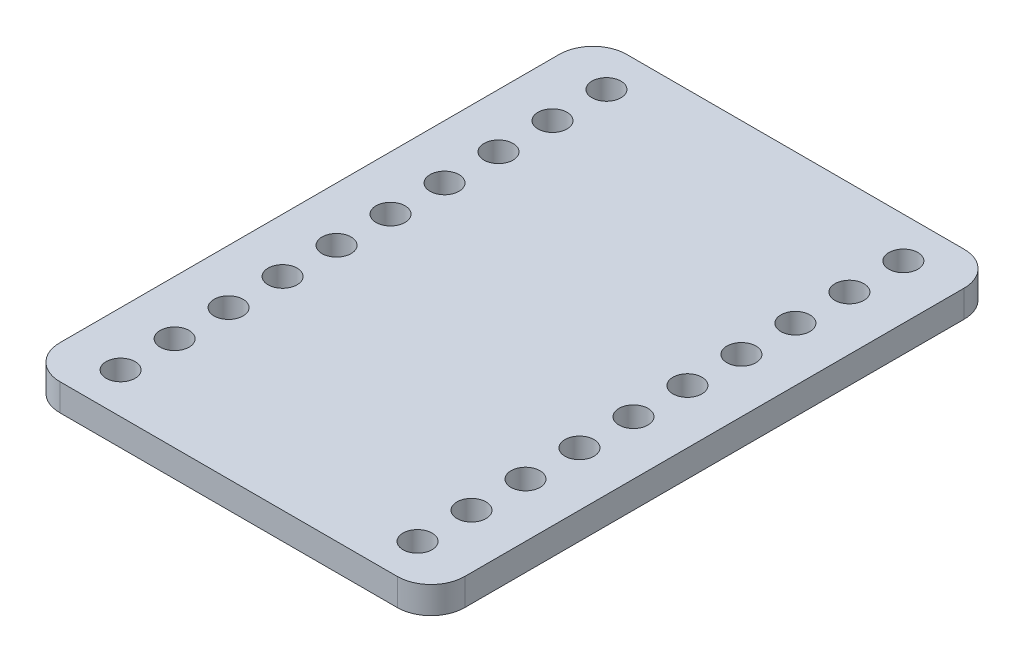
ISO-10303-21;
HEADER;
FILE_DESCRIPTION(('STEP AP214'),'2;1');
FILE_NAME('part.step','',(''),(''),'','','');
FILE_SCHEMA(('AUTOMOTIVE_DESIGN { 1 0 10303 214 1 1 1 1 }'));
ENDSEC;
DATA;
#1=APPLICATION_CONTEXT('core data for automotive mechanical design processes');
#2=APPLICATION_PROTOCOL_DEFINITION('international standard','automotive_design',2000,#1);
#3=PRODUCT_CONTEXT('',#1,'mechanical');
#4=PRODUCT('Part','Part','',(#3));
#5=PRODUCT_RELATED_PRODUCT_CATEGORY('part','',(#4));
#6=PRODUCT_DEFINITION_FORMATION('','',#4);
#7=PRODUCT_DEFINITION_CONTEXT('part definition',#1,'design');
#8=PRODUCT_DEFINITION('design','',#6,#7);
#9=PRODUCT_DEFINITION_SHAPE('','',#8);
#10=(LENGTH_UNIT() NAMED_UNIT(*) SI_UNIT(.MILLI.,.METRE.));
#11=(NAMED_UNIT(*) PLANE_ANGLE_UNIT() SI_UNIT($,.RADIAN.));
#12=(NAMED_UNIT(*) SI_UNIT($,.STERADIAN.) SOLID_ANGLE_UNIT());
#13=UNCERTAINTY_MEASURE_WITH_UNIT(LENGTH_MEASURE(1.E-05),#10,'distance_accuracy_value','');
#14=(GEOMETRIC_REPRESENTATION_CONTEXT(3) GLOBAL_UNCERTAINTY_ASSIGNED_CONTEXT((#13)) GLOBAL_UNIT_ASSIGNED_CONTEXT((#10,
#11,#12)) REPRESENTATION_CONTEXT('',''));
#15=CARTESIAN_POINT('',(0.,0.,0.));
#16=DIRECTION('',(0.,0.,1.));
#17=DIRECTION('',(1.,0.,0.));
#18=AXIS2_PLACEMENT_3D('',#15,#16,#17);
#19=CARTESIAN_POINT('',(0.,4.,0.));
#20=DIRECTION('',(0.,1.,0.));
#21=DIRECTION('',(0.,0.,1.));
#22=AXIS2_PLACEMENT_3D('',#19,#20,#21);
#23=PLANE('',#22);
#24=CARTESIAN_POINT('',(-21.9999999999993,4.,28.));
#25=DIRECTION('',(0.,1.,0.));
#26=DIRECTION('',(0.,0.,1.));
#27=AXIS2_PLACEMENT_3D('',#24,#25,#26);
#28=CIRCLE('',#27,2.15);
#29=CARTESIAN_POINT('',(-21.9999999999993,4.,30.15));
#30=VERTEX_POINT('',#29);
#31=EDGE_CURVE('E347',#30,#30,#28,.T.);
#32=ORIENTED_EDGE('',*,*,#31,.F.);
#33=EDGE_LOOP('',(#32));
#34=FACE_BOUND('',#33,.T.);
#35=CARTESIAN_POINT('',(-21.9999999999995,4.,12.));
#36=DIRECTION('',(0.,1.,0.));
#37=DIRECTION('',(0.,0.,1.));
#38=AXIS2_PLACEMENT_3D('',#35,#36,#37);
#39=CIRCLE('',#38,2.15);
#40=CARTESIAN_POINT('',(-21.9999999999995,4.,14.15));
#41=VERTEX_POINT('',#40);
#42=EDGE_CURVE('E331',#41,#41,#39,.T.);
#43=ORIENTED_EDGE('',*,*,#42,.F.);
#44=EDGE_LOOP('',(#43));
#45=FACE_BOUND('',#44,.T.);
#46=CARTESIAN_POINT('',(-21.9999999999997,4.,-3.99999999999998));
#47=DIRECTION('',(0.,1.,0.));
#48=DIRECTION('',(0.,0.,1.));
#49=AXIS2_PLACEMENT_3D('',#46,#47,#48);
#50=CIRCLE('',#49,2.15);
#51=CARTESIAN_POINT('',(-21.9999999999997,4.,-1.84999999999998));
#52=VERTEX_POINT('',#51);
#53=EDGE_CURVE('E315',#52,#52,#50,.T.);
#54=ORIENTED_EDGE('',*,*,#53,.F.);
#55=EDGE_LOOP('',(#54));
#56=FACE_BOUND('',#55,.T.);
#57=CARTESIAN_POINT('',(-21.9999999999998,4.,-20.));
#58=DIRECTION('',(0.,1.,0.));
#59=DIRECTION('',(0.,0.,1.));
#60=AXIS2_PLACEMENT_3D('',#57,#58,#59);
#61=CIRCLE('',#60,2.15);
#62=CARTESIAN_POINT('',(-21.9999999999998,4.,-17.85));
#63=VERTEX_POINT('',#62);
#64=EDGE_CURVE('E299',#63,#63,#61,.T.);
#65=ORIENTED_EDGE('',*,*,#64,.F.);
#66=EDGE_LOOP('',(#65));
#67=FACE_BOUND('',#66,.T.);
#68=CARTESIAN_POINT('',(22.0000000000007,4.,36.));
#69=DIRECTION('',(0.,1.,0.));
#70=DIRECTION('',(0.,0.,1.));
#71=AXIS2_PLACEMENT_3D('',#68,#69,#70);
#72=CIRCLE('',#71,2.15);
#73=CARTESIAN_POINT('',(22.0000000000007,4.,38.15));
#74=VERTEX_POINT('',#73);
#75=EDGE_CURVE('E283',#74,#74,#72,.T.);
#76=ORIENTED_EDGE('',*,*,#75,.F.);
#77=EDGE_LOOP('',(#76));
#78=FACE_BOUND('',#77,.T.);
#79=CARTESIAN_POINT('',(22.0000000000006,4.,20.));
#80=DIRECTION('',(0.,1.,0.));
#81=DIRECTION('',(0.,0.,1.));
#82=AXIS2_PLACEMENT_3D('',#79,#80,#81);
#83=CIRCLE('',#82,2.15);
#84=CARTESIAN_POINT('',(22.0000000000006,4.,22.15));
#85=VERTEX_POINT('',#84);
#86=EDGE_CURVE('E267',#85,#85,#83,.T.);
#87=ORIENTED_EDGE('',*,*,#86,.F.);
#88=EDGE_LOOP('',(#87));
#89=FACE_BOUND('',#88,.T.);
#90=CARTESIAN_POINT('',(22.0000000000004,4.,4.00000000000002));
#91=DIRECTION('',(0.,1.,0.));
#92=DIRECTION('',(0.,0.,1.));
#93=AXIS2_PLACEMENT_3D('',#90,#91,#92);
#94=CIRCLE('',#93,2.15);
#95=CARTESIAN_POINT('',(22.0000000000004,4.,6.15000000000001));
#96=VERTEX_POINT('',#95);
#97=EDGE_CURVE('E251',#96,#96,#94,.T.);
#98=ORIENTED_EDGE('',*,*,#97,.F.);
#99=EDGE_LOOP('',(#98));
#100=FACE_BOUND('',#99,.T.);
#101=CARTESIAN_POINT('',(22.0000000000002,4.,-12.));
#102=DIRECTION('',(0.,1.,0.));
#103=DIRECTION('',(0.,0.,1.));
#104=AXIS2_PLACEMENT_3D('',#101,#102,#103);
#105=CIRCLE('',#104,2.15);
#106=CARTESIAN_POINT('',(22.0000000000002,4.,-9.84999999999999));
#107=VERTEX_POINT('',#106);
#108=EDGE_CURVE('E235',#107,#107,#105,.T.);
#109=ORIENTED_EDGE('',*,*,#108,.F.);
#110=EDGE_LOOP('',(#109));
#111=FACE_BOUND('',#110,.T.);
#112=CARTESIAN_POINT('',(22.0000000000001,4.,-28.));
#113=DIRECTION('',(0.,1.,0.));
#114=DIRECTION('',(0.,0.,1.));
#115=AXIS2_PLACEMENT_3D('',#112,#113,#114);
#116=CIRCLE('',#115,2.15);
#117=CARTESIAN_POINT('',(22.0000000000001,4.,-25.85));
#118=VERTEX_POINT('',#117);
#119=EDGE_CURVE('E219',#118,#118,#116,.T.);
#120=ORIENTED_EDGE('',*,*,#119,.F.);
#121=EDGE_LOOP('',(#120));
#122=FACE_BOUND('',#121,.T.);
#123=CARTESIAN_POINT('',(-22.,4.,-36.));
#124=DIRECTION('',(0.,1.,0.));
#125=DIRECTION('',(0.,0.,1.));
#126=AXIS2_PLACEMENT_3D('',#123,#124,#125);
#127=CIRCLE('',#126,2.15);
#128=CARTESIAN_POINT('',(-22.,4.,-33.85));
#129=VERTEX_POINT('',#128);
#130=EDGE_CURVE('E145',#129,#129,#127,.T.);
#131=ORIENTED_EDGE('',*,*,#130,.F.);
#132=EDGE_LOOP('',(#131));
#133=FACE_BOUND('',#132,.T.);
#134=DIRECTION('',(0.,0.,-1.));
#135=VECTOR('',#134,1.);
#136=CARTESIAN_POINT('',(30.,4.,-42.));
#137=LINE('',#136,#135);
#138=CARTESIAN_POINT('',(30.,4.,37.));
#139=VERTEX_POINT('',#138);
#140=CARTESIAN_POINT('',(30.,4.,-37.));
#141=VERTEX_POINT('',#140);
#142=EDGE_CURVE('E151',#139,#141,#137,.T.);
#143=ORIENTED_EDGE('',*,*,#142,.T.);
#144=CARTESIAN_POINT('',(25.,4.,-37.));
#145=DIRECTION('',(0.,1.,0.));
#146=DIRECTION('',(0.,0.,1.));
#147=AXIS2_PLACEMENT_3D('',#144,#145,#146);
#148=CIRCLE('',#147,5.);
#149=CARTESIAN_POINT('',(25.,4.,-42.));
#150=VERTEX_POINT('',#149);
#151=EDGE_CURVE('E174',#141,#150,#148,.T.);
#152=ORIENTED_EDGE('',*,*,#151,.T.);
#153=DIRECTION('',(-1.,0.,0.));
#154=VECTOR('',#153,1.);
#155=CARTESIAN_POINT('',(-30.,4.,-42.));
#156=LINE('',#155,#154);
#157=CARTESIAN_POINT('',(-25.,4.,-42.));
#158=VERTEX_POINT('',#157);
#159=EDGE_CURVE('E127',#150,#158,#156,.T.);
#160=ORIENTED_EDGE('',*,*,#159,.T.);
#161=CARTESIAN_POINT('',(-25.,4.,-37.));
#162=DIRECTION('',(0.,1.,0.));
#163=DIRECTION('',(0.,0.,1.));
#164=AXIS2_PLACEMENT_3D('',#161,#162,#163);
#165=CIRCLE('',#164,5.);
#166=CARTESIAN_POINT('',(-30.,4.,-37.));
#167=VERTEX_POINT('',#166);
#168=EDGE_CURVE('E169',#158,#167,#165,.T.);
#169=ORIENTED_EDGE('',*,*,#168,.T.);
#170=DIRECTION('',(0.,0.,1.));
#171=VECTOR('',#170,1.);
#172=CARTESIAN_POINT('',(-30.,4.,-42.));
#173=LINE('',#172,#171);
#174=CARTESIAN_POINT('',(-30.,4.,37.));
#175=VERTEX_POINT('',#174);
#176=EDGE_CURVE('E189',#167,#175,#173,.T.);
#177=ORIENTED_EDGE('',*,*,#176,.T.);
#178=CARTESIAN_POINT('',(-25.,4.,37.));
#179=DIRECTION('',(0.,1.,0.));
#180=DIRECTION('',(0.,0.,1.));
#181=AXIS2_PLACEMENT_3D('',#178,#179,#180);
#182=CIRCLE('',#181,5.);
#183=CARTESIAN_POINT('',(-25.,4.,42.));
#184=VERTEX_POINT('',#183);
#185=EDGE_CURVE('E62',#175,#184,#182,.T.);
#186=ORIENTED_EDGE('',*,*,#185,.T.);
#187=DIRECTION('',(1.,0.,0.));
#188=VECTOR('',#187,1.);
#189=CARTESIAN_POINT('',(-30.,4.,42.));
#190=LINE('',#189,#188);
#191=CARTESIAN_POINT('',(25.,4.,42.));
#192=VERTEX_POINT('',#191);
#193=EDGE_CURVE('E153',#184,#192,#190,.T.);
#194=ORIENTED_EDGE('',*,*,#193,.T.);
#195=CARTESIAN_POINT('',(25.,4.,37.));
#196=DIRECTION('',(0.,1.,0.));
#197=DIRECTION('',(0.,0.,1.));
#198=AXIS2_PLACEMENT_3D('',#195,#196,#197);
#199=CIRCLE('',#198,5.);
#200=EDGE_CURVE('E166',#192,#139,#199,.T.);
#201=ORIENTED_EDGE('',*,*,#200,.T.);
#202=EDGE_LOOP('',(#143,#152,#160,#169,#177,#186,#194,#201));
#203=FACE_BOUND('',#202,.T.);
#204=CARTESIAN_POINT('',(22.,4.,-36.));
#205=DIRECTION('',(0.,1.,0.));
#206=DIRECTION('',(0.,0.,1.));
#207=AXIS2_PLACEMENT_3D('',#204,#205,#206);
#208=CIRCLE('',#207,2.15);
#209=CARTESIAN_POINT('',(22.,4.,-33.85));
#210=VERTEX_POINT('',#209);
#211=EDGE_CURVE('E211',#210,#210,#208,.T.);
#212=ORIENTED_EDGE('',*,*,#211,.F.);
#213=EDGE_LOOP('',(#212));
#214=FACE_BOUND('',#213,.T.);
#215=CARTESIAN_POINT('',(22.0000000000002,4.,-20.));
#216=DIRECTION('',(0.,1.,0.));
#217=DIRECTION('',(0.,0.,1.));
#218=AXIS2_PLACEMENT_3D('',#215,#216,#217);
#219=CIRCLE('',#218,2.15);
#220=CARTESIAN_POINT('',(22.0000000000002,4.,-17.85));
#221=VERTEX_POINT('',#220);
#222=EDGE_CURVE('E227',#221,#221,#219,.T.);
#223=ORIENTED_EDGE('',*,*,#222,.F.);
#224=EDGE_LOOP('',(#223));
#225=FACE_BOUND('',#224,.T.);
#226=CARTESIAN_POINT('',(22.0000000000003,4.,-3.99999999999998));
#227=DIRECTION('',(0.,1.,0.));
#228=DIRECTION('',(0.,0.,1.));
#229=AXIS2_PLACEMENT_3D('',#226,#227,#228);
#230=CIRCLE('',#229,2.15);
#231=CARTESIAN_POINT('',(22.0000000000003,4.,-1.84999999999998));
#232=VERTEX_POINT('',#231);
#233=EDGE_CURVE('E243',#232,#232,#230,.T.);
#234=ORIENTED_EDGE('',*,*,#233,.F.);
#235=EDGE_LOOP('',(#234));
#236=FACE_BOUND('',#235,.T.);
#237=CARTESIAN_POINT('',(22.0000000000005,4.,12.));
#238=DIRECTION('',(0.,1.,0.));
#239=DIRECTION('',(0.,0.,1.));
#240=AXIS2_PLACEMENT_3D('',#237,#238,#239);
#241=CIRCLE('',#240,2.15);
#242=CARTESIAN_POINT('',(22.0000000000005,4.,14.15));
#243=VERTEX_POINT('',#242);
#244=EDGE_CURVE('E259',#243,#243,#241,.T.);
#245=ORIENTED_EDGE('',*,*,#244,.F.);
#246=EDGE_LOOP('',(#245));
#247=FACE_BOUND('',#246,.T.);
#248=CARTESIAN_POINT('',(22.0000000000007,4.,28.));
#249=DIRECTION('',(0.,1.,0.));
#250=DIRECTION('',(0.,0.,1.));
#251=AXIS2_PLACEMENT_3D('',#248,#249,#250);
#252=CIRCLE('',#251,2.15);
#253=CARTESIAN_POINT('',(22.0000000000007,4.,30.15));
#254=VERTEX_POINT('',#253);
#255=EDGE_CURVE('E275',#254,#254,#252,.T.);
#256=ORIENTED_EDGE('',*,*,#255,.F.);
#257=EDGE_LOOP('',(#256));
#258=FACE_BOUND('',#257,.T.);
#259=CARTESIAN_POINT('',(-21.9999999999999,4.,-28.));
#260=DIRECTION('',(0.,1.,0.));
#261=DIRECTION('',(0.,0.,1.));
#262=AXIS2_PLACEMENT_3D('',#259,#260,#261);
#263=CIRCLE('',#262,2.15);
#264=CARTESIAN_POINT('',(-21.9999999999999,4.,-25.85));
#265=VERTEX_POINT('',#264);
#266=EDGE_CURVE('E291',#265,#265,#263,.T.);
#267=ORIENTED_EDGE('',*,*,#266,.F.);
#268=EDGE_LOOP('',(#267));
#269=FACE_BOUND('',#268,.T.);
#270=CARTESIAN_POINT('',(-21.9999999999997,4.,-12.));
#271=DIRECTION('',(0.,1.,0.));
#272=DIRECTION('',(0.,0.,1.));
#273=AXIS2_PLACEMENT_3D('',#270,#271,#272);
#274=CIRCLE('',#273,2.15);
#275=CARTESIAN_POINT('',(-21.9999999999997,4.,-9.84999999999999));
#276=VERTEX_POINT('',#275);
#277=EDGE_CURVE('E307',#276,#276,#274,.T.);
#278=ORIENTED_EDGE('',*,*,#277,.F.);
#279=EDGE_LOOP('',(#278));
#280=FACE_BOUND('',#279,.T.);
#281=CARTESIAN_POINT('',(-21.9999999999996,4.,4.00000000000002));
#282=DIRECTION('',(0.,1.,0.));
#283=DIRECTION('',(0.,0.,1.));
#284=AXIS2_PLACEMENT_3D('',#281,#282,#283);
#285=CIRCLE('',#284,2.15);
#286=CARTESIAN_POINT('',(-21.9999999999996,4.,6.15000000000001));
#287=VERTEX_POINT('',#286);
#288=EDGE_CURVE('E323',#287,#287,#285,.T.);
#289=ORIENTED_EDGE('',*,*,#288,.F.);
#290=EDGE_LOOP('',(#289));
#291=FACE_BOUND('',#290,.T.);
#292=CARTESIAN_POINT('',(-21.9999999999994,4.,20.));
#293=DIRECTION('',(0.,1.,0.));
#294=DIRECTION('',(0.,0.,1.));
#295=AXIS2_PLACEMENT_3D('',#292,#293,#294);
#296=CIRCLE('',#295,2.15);
#297=CARTESIAN_POINT('',(-21.9999999999994,4.,22.15));
#298=VERTEX_POINT('',#297);
#299=EDGE_CURVE('E339',#298,#298,#296,.T.);
#300=ORIENTED_EDGE('',*,*,#299,.F.);
#301=EDGE_LOOP('',(#300));
#302=FACE_BOUND('',#301,.T.);
#303=CARTESIAN_POINT('',(-21.9999999999993,4.,36.));
#304=DIRECTION('',(0.,1.,0.));
#305=DIRECTION('',(0.,0.,1.));
#306=AXIS2_PLACEMENT_3D('',#303,#304,#305);
#307=CIRCLE('',#306,2.15);
#308=CARTESIAN_POINT('',(-21.9999999999993,4.,38.15));
#309=VERTEX_POINT('',#308);
#310=EDGE_CURVE('E355',#309,#309,#307,.T.);
#311=ORIENTED_EDGE('',*,*,#310,.F.);
#312=EDGE_LOOP('',(#311));
#313=FACE_BOUND('',#312,.T.);
#314=ADVANCED_FACE('F39',(#34,#45,#56,#67,#78,#89,#100,#111,#122,#133,#203,#214,#225,#236,#247,
#258,#269,#280,#291,#302,#313),#23,.T.);
#315=CARTESIAN_POINT('',(0.,0.,0.));
#316=DIRECTION('',(0.,1.,0.));
#317=DIRECTION('',(0.,0.,1.));
#318=AXIS2_PLACEMENT_3D('',#315,#316,#317);
#319=PLANE('',#318);
#320=DIRECTION('',(-1.,0.,0.));
#321=VECTOR('',#320,1.);
#322=CARTESIAN_POINT('',(-30.,0.,-42.));
#323=LINE('',#322,#321);
#324=CARTESIAN_POINT('',(25.,0.,-42.));
#325=VERTEX_POINT('',#324);
#326=CARTESIAN_POINT('',(-25.,0.,-42.));
#327=VERTEX_POINT('',#326);
#328=EDGE_CURVE('E124',#325,#327,#323,.T.);
#329=ORIENTED_EDGE('',*,*,#328,.F.);
#330=CARTESIAN_POINT('',(25.,0.,-37.));
#331=DIRECTION('',(0.,1.,0.));
#332=DIRECTION('',(0.,0.,1.));
#333=AXIS2_PLACEMENT_3D('',#330,#331,#332);
#334=CIRCLE('',#333,5.);
#335=CARTESIAN_POINT('',(30.,0.,-37.));
#336=VERTEX_POINT('',#335);
#337=EDGE_CURVE('E106',#325,#336,#334,.F.);
#338=ORIENTED_EDGE('',*,*,#337,.T.);
#339=DIRECTION('',(0.,0.,-1.));
#340=VECTOR('',#339,1.);
#341=CARTESIAN_POINT('',(30.,0.,-42.));
#342=LINE('',#341,#340);
#343=CARTESIAN_POINT('',(30.,0.,37.));
#344=VERTEX_POINT('',#343);
#345=EDGE_CURVE('E138',#344,#336,#342,.T.);
#346=ORIENTED_EDGE('',*,*,#345,.F.);
#347=CARTESIAN_POINT('',(25.,0.,37.));
#348=DIRECTION('',(0.,1.,0.));
#349=DIRECTION('',(0.,0.,1.));
#350=AXIS2_PLACEMENT_3D('',#347,#348,#349);
#351=CIRCLE('',#350,5.);
#352=CARTESIAN_POINT('',(25.,0.,42.));
#353=VERTEX_POINT('',#352);
#354=EDGE_CURVE('E129',#344,#353,#351,.F.);
#355=ORIENTED_EDGE('',*,*,#354,.T.);
#356=DIRECTION('',(1.,0.,0.));
#357=VECTOR('',#356,1.);
#358=CARTESIAN_POINT('',(-30.,0.,42.));
#359=LINE('',#358,#357);
#360=CARTESIAN_POINT('',(-25.,0.,42.));
#361=VERTEX_POINT('',#360);
#362=EDGE_CURVE('E143',#361,#353,#359,.T.);
#363=ORIENTED_EDGE('',*,*,#362,.F.);
#364=CARTESIAN_POINT('',(-25.,0.,37.));
#365=DIRECTION('',(0.,1.,0.));
#366=DIRECTION('',(0.,0.,1.));
#367=AXIS2_PLACEMENT_3D('',#364,#365,#366);
#368=CIRCLE('',#367,5.);
#369=CARTESIAN_POINT('',(-30.,0.,37.));
#370=VERTEX_POINT('',#369);
#371=EDGE_CURVE('E118',#361,#370,#368,.F.);
#372=ORIENTED_EDGE('',*,*,#371,.T.);
#373=DIRECTION('',(0.,0.,1.));
#374=VECTOR('',#373,1.);
#375=CARTESIAN_POINT('',(-30.,0.,-42.));
#376=LINE('',#375,#374);
#377=CARTESIAN_POINT('',(-30.,0.,-37.));
#378=VERTEX_POINT('',#377);
#379=EDGE_CURVE('E137',#378,#370,#376,.T.);
#380=ORIENTED_EDGE('',*,*,#379,.F.);
#381=CARTESIAN_POINT('',(-25.,0.,-37.));
#382=DIRECTION('',(0.,1.,0.));
#383=DIRECTION('',(0.,0.,1.));
#384=AXIS2_PLACEMENT_3D('',#381,#382,#383);
#385=CIRCLE('',#384,5.);
#386=EDGE_CURVE('E135',#378,#327,#385,.F.);
#387=ORIENTED_EDGE('',*,*,#386,.T.);
#388=EDGE_LOOP('',(#329,#338,#346,#355,#363,#372,#380,#387));
#389=FACE_BOUND('',#388,.T.);
#390=CARTESIAN_POINT('',(-22.,0.,-36.));
#391=DIRECTION('',(0.,1.,0.));
#392=DIRECTION('',(0.,0.,1.));
#393=AXIS2_PLACEMENT_3D('',#390,#391,#392);
#394=CIRCLE('',#393,2.15);
#395=CARTESIAN_POINT('',(-22.,0.,-33.85));
#396=VERTEX_POINT('',#395);
#397=EDGE_CURVE('E207',#396,#396,#394,.T.);
#398=ORIENTED_EDGE('',*,*,#397,.T.);
#399=EDGE_LOOP('',(#398));
#400=FACE_BOUND('',#399,.T.);
#401=CARTESIAN_POINT('',(22.,0.,-36.));
#402=DIRECTION('',(0.,1.,0.));
#403=DIRECTION('',(0.,0.,1.));
#404=AXIS2_PLACEMENT_3D('',#401,#402,#403);
#405=CIRCLE('',#404,2.15);
#406=CARTESIAN_POINT('',(22.,0.,-33.85));
#407=VERTEX_POINT('',#406);
#408=EDGE_CURVE('E215',#407,#407,#405,.T.);
#409=ORIENTED_EDGE('',*,*,#408,.T.);
#410=EDGE_LOOP('',(#409));
#411=FACE_BOUND('',#410,.T.);
#412=CARTESIAN_POINT('',(22.0000000000001,0.,-28.));
#413=DIRECTION('',(0.,1.,0.));
#414=DIRECTION('',(0.,0.,1.));
#415=AXIS2_PLACEMENT_3D('',#412,#413,#414);
#416=CIRCLE('',#415,2.15);
#417=CARTESIAN_POINT('',(22.0000000000001,0.,-25.85));
#418=VERTEX_POINT('',#417);
#419=EDGE_CURVE('E223',#418,#418,#416,.T.);
#420=ORIENTED_EDGE('',*,*,#419,.T.);
#421=EDGE_LOOP('',(#420));
#422=FACE_BOUND('',#421,.T.);
#423=CARTESIAN_POINT('',(22.0000000000002,0.,-20.));
#424=DIRECTION('',(0.,1.,0.));
#425=DIRECTION('',(0.,0.,1.));
#426=AXIS2_PLACEMENT_3D('',#423,#424,#425);
#427=CIRCLE('',#426,2.15);
#428=CARTESIAN_POINT('',(22.0000000000002,0.,-17.85));
#429=VERTEX_POINT('',#428);
#430=EDGE_CURVE('E231',#429,#429,#427,.T.);
#431=ORIENTED_EDGE('',*,*,#430,.T.);
#432=EDGE_LOOP('',(#431));
#433=FACE_BOUND('',#432,.T.);
#434=CARTESIAN_POINT('',(22.0000000000002,0.,-12.));
#435=DIRECTION('',(0.,1.,0.));
#436=DIRECTION('',(0.,0.,1.));
#437=AXIS2_PLACEMENT_3D('',#434,#435,#436);
#438=CIRCLE('',#437,2.15);
#439=CARTESIAN_POINT('',(22.0000000000002,0.,-9.84999999999999));
#440=VERTEX_POINT('',#439);
#441=EDGE_CURVE('E239',#440,#440,#438,.T.);
#442=ORIENTED_EDGE('',*,*,#441,.T.);
#443=EDGE_LOOP('',(#442));
#444=FACE_BOUND('',#443,.T.);
#445=CARTESIAN_POINT('',(22.0000000000003,0.,-3.99999999999998));
#446=DIRECTION('',(0.,1.,0.));
#447=DIRECTION('',(0.,0.,1.));
#448=AXIS2_PLACEMENT_3D('',#445,#446,#447);
#449=CIRCLE('',#448,2.15);
#450=CARTESIAN_POINT('',(22.0000000000003,0.,-1.84999999999998));
#451=VERTEX_POINT('',#450);
#452=EDGE_CURVE('E247',#451,#451,#449,.T.);
#453=ORIENTED_EDGE('',*,*,#452,.T.);
#454=EDGE_LOOP('',(#453));
#455=FACE_BOUND('',#454,.T.);
#456=CARTESIAN_POINT('',(22.0000000000004,0.,4.00000000000002));
#457=DIRECTION('',(0.,1.,0.));
#458=DIRECTION('',(0.,0.,1.));
#459=AXIS2_PLACEMENT_3D('',#456,#457,#458);
#460=CIRCLE('',#459,2.15);
#461=CARTESIAN_POINT('',(22.0000000000004,0.,6.15000000000001));
#462=VERTEX_POINT('',#461);
#463=EDGE_CURVE('E255',#462,#462,#460,.T.);
#464=ORIENTED_EDGE('',*,*,#463,.T.);
#465=EDGE_LOOP('',(#464));
#466=FACE_BOUND('',#465,.T.);
#467=CARTESIAN_POINT('',(22.0000000000005,0.,12.));
#468=DIRECTION('',(0.,1.,0.));
#469=DIRECTION('',(0.,0.,1.));
#470=AXIS2_PLACEMENT_3D('',#467,#468,#469);
#471=CIRCLE('',#470,2.15);
#472=CARTESIAN_POINT('',(22.0000000000005,0.,14.15));
#473=VERTEX_POINT('',#472);
#474=EDGE_CURVE('E263',#473,#473,#471,.T.);
#475=ORIENTED_EDGE('',*,*,#474,.T.);
#476=EDGE_LOOP('',(#475));
#477=FACE_BOUND('',#476,.T.);
#478=CARTESIAN_POINT('',(22.0000000000006,0.,20.));
#479=DIRECTION('',(0.,1.,0.));
#480=DIRECTION('',(0.,0.,1.));
#481=AXIS2_PLACEMENT_3D('',#478,#479,#480);
#482=CIRCLE('',#481,2.15);
#483=CARTESIAN_POINT('',(22.0000000000006,0.,22.15));
#484=VERTEX_POINT('',#483);
#485=EDGE_CURVE('E271',#484,#484,#482,.T.);
#486=ORIENTED_EDGE('',*,*,#485,.T.);
#487=EDGE_LOOP('',(#486));
#488=FACE_BOUND('',#487,.T.);
#489=CARTESIAN_POINT('',(22.0000000000007,0.,28.));
#490=DIRECTION('',(0.,1.,0.));
#491=DIRECTION('',(0.,0.,1.));
#492=AXIS2_PLACEMENT_3D('',#489,#490,#491);
#493=CIRCLE('',#492,2.15);
#494=CARTESIAN_POINT('',(22.0000000000007,0.,30.15));
#495=VERTEX_POINT('',#494);
#496=EDGE_CURVE('E279',#495,#495,#493,.T.);
#497=ORIENTED_EDGE('',*,*,#496,.T.);
#498=EDGE_LOOP('',(#497));
#499=FACE_BOUND('',#498,.T.);
#500=CARTESIAN_POINT('',(22.0000000000007,0.,36.));
#501=DIRECTION('',(0.,1.,0.));
#502=DIRECTION('',(0.,0.,1.));
#503=AXIS2_PLACEMENT_3D('',#500,#501,#502);
#504=CIRCLE('',#503,2.15);
#505=CARTESIAN_POINT('',(22.0000000000007,0.,38.15));
#506=VERTEX_POINT('',#505);
#507=EDGE_CURVE('E287',#506,#506,#504,.T.);
#508=ORIENTED_EDGE('',*,*,#507,.T.);
#509=EDGE_LOOP('',(#508));
#510=FACE_BOUND('',#509,.T.);
#511=CARTESIAN_POINT('',(-21.9999999999999,0.,-28.));
#512=DIRECTION('',(0.,1.,0.));
#513=DIRECTION('',(0.,0.,1.));
#514=AXIS2_PLACEMENT_3D('',#511,#512,#513);
#515=CIRCLE('',#514,2.15);
#516=CARTESIAN_POINT('',(-21.9999999999999,0.,-25.85));
#517=VERTEX_POINT('',#516);
#518=EDGE_CURVE('E295',#517,#517,#515,.T.);
#519=ORIENTED_EDGE('',*,*,#518,.T.);
#520=EDGE_LOOP('',(#519));
#521=FACE_BOUND('',#520,.T.);
#522=CARTESIAN_POINT('',(-21.9999999999998,0.,-20.));
#523=DIRECTION('',(0.,1.,0.));
#524=DIRECTION('',(0.,0.,1.));
#525=AXIS2_PLACEMENT_3D('',#522,#523,#524);
#526=CIRCLE('',#525,2.15);
#527=CARTESIAN_POINT('',(-21.9999999999998,0.,-17.85));
#528=VERTEX_POINT('',#527);
#529=EDGE_CURVE('E303',#528,#528,#526,.T.);
#530=ORIENTED_EDGE('',*,*,#529,.T.);
#531=EDGE_LOOP('',(#530));
#532=FACE_BOUND('',#531,.T.);
#533=CARTESIAN_POINT('',(-21.9999999999997,0.,-12.));
#534=DIRECTION('',(0.,1.,0.));
#535=DIRECTION('',(0.,0.,1.));
#536=AXIS2_PLACEMENT_3D('',#533,#534,#535);
#537=CIRCLE('',#536,2.15);
#538=CARTESIAN_POINT('',(-21.9999999999997,0.,-9.84999999999999));
#539=VERTEX_POINT('',#538);
#540=EDGE_CURVE('E311',#539,#539,#537,.T.);
#541=ORIENTED_EDGE('',*,*,#540,.T.);
#542=EDGE_LOOP('',(#541));
#543=FACE_BOUND('',#542,.T.);
#544=CARTESIAN_POINT('',(-21.9999999999997,0.,-3.99999999999998));
#545=DIRECTION('',(0.,1.,0.));
#546=DIRECTION('',(0.,0.,1.));
#547=AXIS2_PLACEMENT_3D('',#544,#545,#546);
#548=CIRCLE('',#547,2.15);
#549=CARTESIAN_POINT('',(-21.9999999999997,0.,-1.84999999999998));
#550=VERTEX_POINT('',#549);
#551=EDGE_CURVE('E319',#550,#550,#548,.T.);
#552=ORIENTED_EDGE('',*,*,#551,.T.);
#553=EDGE_LOOP('',(#552));
#554=FACE_BOUND('',#553,.T.);
#555=CARTESIAN_POINT('',(-21.9999999999996,0.,4.00000000000002));
#556=DIRECTION('',(0.,1.,0.));
#557=DIRECTION('',(0.,0.,1.));
#558=AXIS2_PLACEMENT_3D('',#555,#556,#557);
#559=CIRCLE('',#558,2.15);
#560=CARTESIAN_POINT('',(-21.9999999999996,0.,6.15000000000001));
#561=VERTEX_POINT('',#560);
#562=EDGE_CURVE('E327',#561,#561,#559,.T.);
#563=ORIENTED_EDGE('',*,*,#562,.T.);
#564=EDGE_LOOP('',(#563));
#565=FACE_BOUND('',#564,.T.);
#566=CARTESIAN_POINT('',(-21.9999999999995,0.,12.));
#567=DIRECTION('',(0.,1.,0.));
#568=DIRECTION('',(0.,0.,1.));
#569=AXIS2_PLACEMENT_3D('',#566,#567,#568);
#570=CIRCLE('',#569,2.15);
#571=CARTESIAN_POINT('',(-21.9999999999995,0.,14.15));
#572=VERTEX_POINT('',#571);
#573=EDGE_CURVE('E335',#572,#572,#570,.T.);
#574=ORIENTED_EDGE('',*,*,#573,.T.);
#575=EDGE_LOOP('',(#574));
#576=FACE_BOUND('',#575,.T.);
#577=CARTESIAN_POINT('',(-21.9999999999994,0.,20.));
#578=DIRECTION('',(0.,1.,0.));
#579=DIRECTION('',(0.,0.,1.));
#580=AXIS2_PLACEMENT_3D('',#577,#578,#579);
#581=CIRCLE('',#580,2.15);
#582=CARTESIAN_POINT('',(-21.9999999999994,0.,22.15));
#583=VERTEX_POINT('',#582);
#584=EDGE_CURVE('E343',#583,#583,#581,.T.);
#585=ORIENTED_EDGE('',*,*,#584,.T.);
#586=EDGE_LOOP('',(#585));
#587=FACE_BOUND('',#586,.T.);
#588=CARTESIAN_POINT('',(-21.9999999999993,0.,28.));
#589=DIRECTION('',(0.,1.,0.));
#590=DIRECTION('',(0.,0.,1.));
#591=AXIS2_PLACEMENT_3D('',#588,#589,#590);
#592=CIRCLE('',#591,2.15);
#593=CARTESIAN_POINT('',(-21.9999999999993,0.,30.15));
#594=VERTEX_POINT('',#593);
#595=EDGE_CURVE('E351',#594,#594,#592,.T.);
#596=ORIENTED_EDGE('',*,*,#595,.T.);
#597=EDGE_LOOP('',(#596));
#598=FACE_BOUND('',#597,.T.);
#599=CARTESIAN_POINT('',(-21.9999999999993,0.,36.));
#600=DIRECTION('',(0.,1.,0.));
#601=DIRECTION('',(0.,0.,1.));
#602=AXIS2_PLACEMENT_3D('',#599,#600,#601);
#603=CIRCLE('',#602,2.15);
#604=CARTESIAN_POINT('',(-21.9999999999993,0.,38.15));
#605=VERTEX_POINT('',#604);
#606=EDGE_CURVE('E359',#605,#605,#603,.T.);
#607=ORIENTED_EDGE('',*,*,#606,.T.);
#608=EDGE_LOOP('',(#607));
#609=FACE_BOUND('',#608,.T.);
#610=ADVANCED_FACE('F132',(#389,#400,#411,#422,#433,#444,#455,#466,#477,#488,#499,#510,#521,
#532,#543,#554,#565,#576,#587,#598,#609),#319,.F.);
#611=CARTESIAN_POINT('',(30.,4.,-42.));
#612=DIRECTION('',(-1.,0.,0.));
#613=DIRECTION('',(0.,0.,1.));
#614=AXIS2_PLACEMENT_3D('',#611,#612,#613);
#615=PLANE('',#614);
#616=ORIENTED_EDGE('',*,*,#345,.T.);
#617=DIRECTION('',(0.,-1.,0.));
#618=VECTOR('',#617,1.);
#619=CARTESIAN_POINT('',(30.,4.,-37.));
#620=LINE('',#619,#618);
#621=EDGE_CURVE('E111',#336,#141,#620,.F.);
#622=ORIENTED_EDGE('',*,*,#621,.T.);
#623=ORIENTED_EDGE('',*,*,#142,.F.);
#624=DIRECTION('',(0.,-1.,0.));
#625=VECTOR('',#624,1.);
#626=CARTESIAN_POINT('',(30.,4.,37.));
#627=LINE('',#626,#625);
#628=EDGE_CURVE('E117',#139,#344,#627,.T.);
#629=ORIENTED_EDGE('',*,*,#628,.T.);
#630=EDGE_LOOP('',(#616,#622,#623,#629));
#631=FACE_BOUND('',#630,.T.);
#632=ADVANCED_FACE('F376',(#631),#615,.F.);
#633=CARTESIAN_POINT('',(-30.,4.,-42.));
#634=DIRECTION('',(0.,0.,1.));
#635=DIRECTION('',(1.,0.,0.));
#636=AXIS2_PLACEMENT_3D('',#633,#634,#635);
#637=PLANE('',#636);
#638=ORIENTED_EDGE('',*,*,#159,.F.);
#639=DIRECTION('',(0.,-1.,0.));
#640=VECTOR('',#639,1.);
#641=CARTESIAN_POINT('',(25.,4.,-42.));
#642=LINE('',#641,#640);
#643=EDGE_CURVE('E110',#150,#325,#642,.T.);
#644=ORIENTED_EDGE('',*,*,#643,.T.);
#645=ORIENTED_EDGE('',*,*,#328,.T.);
#646=DIRECTION('',(0.,-1.,0.));
#647=VECTOR('',#646,1.);
#648=CARTESIAN_POINT('',(-25.,4.,-42.));
#649=LINE('',#648,#647);
#650=EDGE_CURVE('E130',#327,#158,#649,.F.);
#651=ORIENTED_EDGE('',*,*,#650,.T.);
#652=EDGE_LOOP('',(#638,#644,#645,#651));
#653=FACE_BOUND('',#652,.T.);
#654=ADVANCED_FACE('F123',(#653),#637,.F.);
#655=CARTESIAN_POINT('',(-30.,4.,-42.));
#656=DIRECTION('',(1.,0.,0.));
#657=DIRECTION('',(0.,0.,-1.));
#658=AXIS2_PLACEMENT_3D('',#655,#656,#657);
#659=PLANE('',#658);
#660=ORIENTED_EDGE('',*,*,#379,.T.);
#661=DIRECTION('',(0.,-1.,0.));
#662=VECTOR('',#661,1.);
#663=CARTESIAN_POINT('',(-30.,4.,37.));
#664=LINE('',#663,#662);
#665=EDGE_CURVE('E11',#370,#175,#664,.F.);
#666=ORIENTED_EDGE('',*,*,#665,.T.);
#667=ORIENTED_EDGE('',*,*,#176,.F.);
#668=DIRECTION('',(0.,-1.,0.));
#669=VECTOR('',#668,1.);
#670=CARTESIAN_POINT('',(-30.,4.,-37.));
#671=LINE('',#670,#669);
#672=EDGE_CURVE('E48',#167,#378,#671,.T.);
#673=ORIENTED_EDGE('',*,*,#672,.T.);
#674=EDGE_LOOP('',(#660,#666,#667,#673));
#675=FACE_BOUND('',#674,.T.);
#676=ADVANCED_FACE('F187',(#675),#659,.F.);
#677=CARTESIAN_POINT('',(-30.,4.,42.));
#678=DIRECTION('',(0.,0.,-1.));
#679=DIRECTION('',(-1.,0.,0.));
#680=AXIS2_PLACEMENT_3D('',#677,#678,#679);
#681=PLANE('',#680);
#682=ORIENTED_EDGE('',*,*,#193,.F.);
#683=DIRECTION('',(0.,-1.,0.));
#684=VECTOR('',#683,1.);
#685=CARTESIAN_POINT('',(-25.,4.,42.));
#686=LINE('',#685,#684);
#687=EDGE_CURVE('E179',#184,#361,#686,.T.);
#688=ORIENTED_EDGE('',*,*,#687,.T.);
#689=ORIENTED_EDGE('',*,*,#362,.T.);
#690=DIRECTION('',(0.,-1.,0.));
#691=VECTOR('',#690,1.);
#692=CARTESIAN_POINT('',(25.,4.,42.));
#693=LINE('',#692,#691);
#694=EDGE_CURVE('E55',#353,#192,#693,.F.);
#695=ORIENTED_EDGE('',*,*,#694,.T.);
#696=EDGE_LOOP('',(#682,#688,#689,#695));
#697=FACE_BOUND('',#696,.T.);
#698=ADVANCED_FACE('F196',(#697),#681,.F.);
#699=CARTESIAN_POINT('',(-22.,4.,-36.));
#700=DIRECTION('',(0.,-1.,0.));
#701=DIRECTION('',(0.,0.,-1.));
#702=AXIS2_PLACEMENT_3D('',#699,#700,#701);
#703=CYLINDRICAL_SURFACE('',#702,2.15);
#704=ORIENTED_EDGE('',*,*,#130,.T.);
#705=EDGE_LOOP('',(#704));
#706=FACE_BOUND('',#705,.T.);
#707=ORIENTED_EDGE('',*,*,#397,.F.);
#708=EDGE_LOOP('',(#707));
#709=FACE_BOUND('',#708,.T.);
#710=ADVANCED_FACE('F381',(#706,#709),#703,.F.);
#711=CARTESIAN_POINT('',(22.,4.,-36.));
#712=DIRECTION('',(0.,-1.,0.));
#713=DIRECTION('',(0.,0.,-1.));
#714=AXIS2_PLACEMENT_3D('',#711,#712,#713);
#715=CYLINDRICAL_SURFACE('',#714,2.15);
#716=ORIENTED_EDGE('',*,*,#211,.T.);
#717=EDGE_LOOP('',(#716));
#718=FACE_BOUND('',#717,.T.);
#719=ORIENTED_EDGE('',*,*,#408,.F.);
#720=EDGE_LOOP('',(#719));
#721=FACE_BOUND('',#720,.T.);
#722=ADVANCED_FACE('F500',(#718,#721),#715,.F.);
#723=CARTESIAN_POINT('',(22.0000000000001,4.,-28.));
#724=DIRECTION('',(0.,-1.,0.));
#725=DIRECTION('',(0.,0.,-1.));
#726=AXIS2_PLACEMENT_3D('',#723,#724,#725);
#727=CYLINDRICAL_SURFACE('',#726,2.15);
#728=ORIENTED_EDGE('',*,*,#119,.T.);
#729=EDGE_LOOP('',(#728));
#730=FACE_BOUND('',#729,.T.);
#731=ORIENTED_EDGE('',*,*,#419,.F.);
#732=EDGE_LOOP('',(#731));
#733=FACE_BOUND('',#732,.T.);
#734=ADVANCED_FACE('F497',(#730,#733),#727,.F.);
#735=CARTESIAN_POINT('',(22.0000000000002,4.,-20.));
#736=DIRECTION('',(0.,-1.,0.));
#737=DIRECTION('',(0.,0.,-1.));
#738=AXIS2_PLACEMENT_3D('',#735,#736,#737);
#739=CYLINDRICAL_SURFACE('',#738,2.15);
#740=ORIENTED_EDGE('',*,*,#222,.T.);
#741=EDGE_LOOP('',(#740));
#742=FACE_BOUND('',#741,.T.);
#743=ORIENTED_EDGE('',*,*,#430,.F.);
#744=EDGE_LOOP('',(#743));
#745=FACE_BOUND('',#744,.T.);
#746=ADVANCED_FACE('F493',(#742,#745),#739,.F.);
#747=CARTESIAN_POINT('',(22.0000000000002,4.,-12.));
#748=DIRECTION('',(0.,-1.,0.));
#749=DIRECTION('',(0.,0.,-1.));
#750=AXIS2_PLACEMENT_3D('',#747,#748,#749);
#751=CYLINDRICAL_SURFACE('',#750,2.15);
#752=ORIENTED_EDGE('',*,*,#108,.T.);
#753=EDGE_LOOP('',(#752));
#754=FACE_BOUND('',#753,.T.);
#755=ORIENTED_EDGE('',*,*,#441,.F.);
#756=EDGE_LOOP('',(#755));
#757=FACE_BOUND('',#756,.T.);
#758=ADVANCED_FACE('F489',(#754,#757),#751,.F.);
#759=CARTESIAN_POINT('',(22.0000000000003,4.,-3.99999999999998));
#760=DIRECTION('',(0.,-1.,0.));
#761=DIRECTION('',(0.,0.,-1.));
#762=AXIS2_PLACEMENT_3D('',#759,#760,#761);
#763=CYLINDRICAL_SURFACE('',#762,2.15);
#764=ORIENTED_EDGE('',*,*,#233,.T.);
#765=EDGE_LOOP('',(#764));
#766=FACE_BOUND('',#765,.T.);
#767=ORIENTED_EDGE('',*,*,#452,.F.);
#768=EDGE_LOOP('',(#767));
#769=FACE_BOUND('',#768,.T.);
#770=ADVANCED_FACE('F485',(#766,#769),#763,.F.);
#771=CARTESIAN_POINT('',(22.0000000000004,4.,4.00000000000002));
#772=DIRECTION('',(0.,-1.,0.));
#773=DIRECTION('',(0.,0.,-1.));
#774=AXIS2_PLACEMENT_3D('',#771,#772,#773);
#775=CYLINDRICAL_SURFACE('',#774,2.15);
#776=ORIENTED_EDGE('',*,*,#97,.T.);
#777=EDGE_LOOP('',(#776));
#778=FACE_BOUND('',#777,.T.);
#779=ORIENTED_EDGE('',*,*,#463,.F.);
#780=EDGE_LOOP('',(#779));
#781=FACE_BOUND('',#780,.T.);
#782=ADVANCED_FACE('F481',(#778,#781),#775,.F.);
#783=CARTESIAN_POINT('',(22.0000000000005,4.,12.));
#784=DIRECTION('',(0.,-1.,0.));
#785=DIRECTION('',(0.,0.,-1.));
#786=AXIS2_PLACEMENT_3D('',#783,#784,#785);
#787=CYLINDRICAL_SURFACE('',#786,2.15);
#788=ORIENTED_EDGE('',*,*,#244,.T.);
#789=EDGE_LOOP('',(#788));
#790=FACE_BOUND('',#789,.T.);
#791=ORIENTED_EDGE('',*,*,#474,.F.);
#792=EDGE_LOOP('',(#791));
#793=FACE_BOUND('',#792,.T.);
#794=ADVANCED_FACE('F477',(#790,#793),#787,.F.);
#795=CARTESIAN_POINT('',(22.0000000000006,4.,20.));
#796=DIRECTION('',(0.,-1.,0.));
#797=DIRECTION('',(0.,0.,-1.));
#798=AXIS2_PLACEMENT_3D('',#795,#796,#797);
#799=CYLINDRICAL_SURFACE('',#798,2.15);
#800=ORIENTED_EDGE('',*,*,#86,.T.);
#801=EDGE_LOOP('',(#800));
#802=FACE_BOUND('',#801,.T.);
#803=ORIENTED_EDGE('',*,*,#485,.F.);
#804=EDGE_LOOP('',(#803));
#805=FACE_BOUND('',#804,.T.);
#806=ADVANCED_FACE('F473',(#802,#805),#799,.F.);
#807=CARTESIAN_POINT('',(22.0000000000007,4.,28.));
#808=DIRECTION('',(0.,-1.,0.));
#809=DIRECTION('',(0.,0.,-1.));
#810=AXIS2_PLACEMENT_3D('',#807,#808,#809);
#811=CYLINDRICAL_SURFACE('',#810,2.15);
#812=ORIENTED_EDGE('',*,*,#255,.T.);
#813=EDGE_LOOP('',(#812));
#814=FACE_BOUND('',#813,.T.);
#815=ORIENTED_EDGE('',*,*,#496,.F.);
#816=EDGE_LOOP('',(#815));
#817=FACE_BOUND('',#816,.T.);
#818=ADVANCED_FACE('F469',(#814,#817),#811,.F.);
#819=CARTESIAN_POINT('',(22.0000000000007,4.,36.));
#820=DIRECTION('',(0.,-1.,0.));
#821=DIRECTION('',(0.,0.,-1.));
#822=AXIS2_PLACEMENT_3D('',#819,#820,#821);
#823=CYLINDRICAL_SURFACE('',#822,2.15);
#824=ORIENTED_EDGE('',*,*,#75,.T.);
#825=EDGE_LOOP('',(#824));
#826=FACE_BOUND('',#825,.T.);
#827=ORIENTED_EDGE('',*,*,#507,.F.);
#828=EDGE_LOOP('',(#827));
#829=FACE_BOUND('',#828,.T.);
#830=ADVANCED_FACE('F465',(#826,#829),#823,.F.);
#831=CARTESIAN_POINT('',(-21.9999999999999,4.,-28.));
#832=DIRECTION('',(0.,-1.,0.));
#833=DIRECTION('',(0.,0.,-1.));
#834=AXIS2_PLACEMENT_3D('',#831,#832,#833);
#835=CYLINDRICAL_SURFACE('',#834,2.15);
#836=ORIENTED_EDGE('',*,*,#266,.T.);
#837=EDGE_LOOP('',(#836));
#838=FACE_BOUND('',#837,.T.);
#839=ORIENTED_EDGE('',*,*,#518,.F.);
#840=EDGE_LOOP('',(#839));
#841=FACE_BOUND('',#840,.T.);
#842=ADVANCED_FACE('F461',(#838,#841),#835,.F.);
#843=CARTESIAN_POINT('',(-21.9999999999998,4.,-20.));
#844=DIRECTION('',(0.,-1.,0.));
#845=DIRECTION('',(0.,0.,-1.));
#846=AXIS2_PLACEMENT_3D('',#843,#844,#845);
#847=CYLINDRICAL_SURFACE('',#846,2.15);
#848=ORIENTED_EDGE('',*,*,#64,.T.);
#849=EDGE_LOOP('',(#848));
#850=FACE_BOUND('',#849,.T.);
#851=ORIENTED_EDGE('',*,*,#529,.F.);
#852=EDGE_LOOP('',(#851));
#853=FACE_BOUND('',#852,.T.);
#854=ADVANCED_FACE('F457',(#850,#853),#847,.F.);
#855=CARTESIAN_POINT('',(-21.9999999999997,4.,-12.));
#856=DIRECTION('',(0.,-1.,0.));
#857=DIRECTION('',(0.,0.,-1.));
#858=AXIS2_PLACEMENT_3D('',#855,#856,#857);
#859=CYLINDRICAL_SURFACE('',#858,2.15);
#860=ORIENTED_EDGE('',*,*,#277,.T.);
#861=EDGE_LOOP('',(#860));
#862=FACE_BOUND('',#861,.T.);
#863=ORIENTED_EDGE('',*,*,#540,.F.);
#864=EDGE_LOOP('',(#863));
#865=FACE_BOUND('',#864,.T.);
#866=ADVANCED_FACE('F453',(#862,#865),#859,.F.);
#867=CARTESIAN_POINT('',(-21.9999999999997,4.,-3.99999999999998));
#868=DIRECTION('',(0.,-1.,0.));
#869=DIRECTION('',(0.,0.,-1.));
#870=AXIS2_PLACEMENT_3D('',#867,#868,#869);
#871=CYLINDRICAL_SURFACE('',#870,2.15);
#872=ORIENTED_EDGE('',*,*,#53,.T.);
#873=EDGE_LOOP('',(#872));
#874=FACE_BOUND('',#873,.T.);
#875=ORIENTED_EDGE('',*,*,#551,.F.);
#876=EDGE_LOOP('',(#875));
#877=FACE_BOUND('',#876,.T.);
#878=ADVANCED_FACE('F449',(#874,#877),#871,.F.);
#879=CARTESIAN_POINT('',(-21.9999999999996,4.,4.00000000000002));
#880=DIRECTION('',(0.,-1.,0.));
#881=DIRECTION('',(0.,0.,-1.));
#882=AXIS2_PLACEMENT_3D('',#879,#880,#881);
#883=CYLINDRICAL_SURFACE('',#882,2.15);
#884=ORIENTED_EDGE('',*,*,#288,.T.);
#885=EDGE_LOOP('',(#884));
#886=FACE_BOUND('',#885,.T.);
#887=ORIENTED_EDGE('',*,*,#562,.F.);
#888=EDGE_LOOP('',(#887));
#889=FACE_BOUND('',#888,.T.);
#890=ADVANCED_FACE('F445',(#886,#889),#883,.F.);
#891=CARTESIAN_POINT('',(-21.9999999999995,4.,12.));
#892=DIRECTION('',(0.,-1.,0.));
#893=DIRECTION('',(0.,0.,-1.));
#894=AXIS2_PLACEMENT_3D('',#891,#892,#893);
#895=CYLINDRICAL_SURFACE('',#894,2.15);
#896=ORIENTED_EDGE('',*,*,#42,.T.);
#897=EDGE_LOOP('',(#896));
#898=FACE_BOUND('',#897,.T.);
#899=ORIENTED_EDGE('',*,*,#573,.F.);
#900=EDGE_LOOP('',(#899));
#901=FACE_BOUND('',#900,.T.);
#902=ADVANCED_FACE('F427',(#898,#901),#895,.F.);
#903=CARTESIAN_POINT('',(-21.9999999999994,4.,20.));
#904=DIRECTION('',(0.,-1.,0.));
#905=DIRECTION('',(0.,0.,-1.));
#906=AXIS2_PLACEMENT_3D('',#903,#904,#905);
#907=CYLINDRICAL_SURFACE('',#906,2.15);
#908=ORIENTED_EDGE('',*,*,#299,.T.);
#909=EDGE_LOOP('',(#908));
#910=FACE_BOUND('',#909,.T.);
#911=ORIENTED_EDGE('',*,*,#584,.F.);
#912=EDGE_LOOP('',(#911));
#913=FACE_BOUND('',#912,.T.);
#914=ADVANCED_FACE('F423',(#910,#913),#907,.F.);
#915=CARTESIAN_POINT('',(-21.9999999999993,4.,28.));
#916=DIRECTION('',(0.,-1.,0.));
#917=DIRECTION('',(0.,0.,-1.));
#918=AXIS2_PLACEMENT_3D('',#915,#916,#917);
#919=CYLINDRICAL_SURFACE('',#918,2.15);
#920=ORIENTED_EDGE('',*,*,#31,.T.);
#921=EDGE_LOOP('',(#920));
#922=FACE_BOUND('',#921,.T.);
#923=ORIENTED_EDGE('',*,*,#595,.F.);
#924=EDGE_LOOP('',(#923));
#925=FACE_BOUND('',#924,.T.);
#926=ADVANCED_FACE('F426',(#922,#925),#919,.F.);
#927=CARTESIAN_POINT('',(-21.9999999999993,4.,36.));
#928=DIRECTION('',(0.,-1.,0.));
#929=DIRECTION('',(0.,0.,-1.));
#930=AXIS2_PLACEMENT_3D('',#927,#928,#929);
#931=CYLINDRICAL_SURFACE('',#930,2.15);
#932=ORIENTED_EDGE('',*,*,#310,.T.);
#933=EDGE_LOOP('',(#932));
#934=FACE_BOUND('',#933,.T.);
#935=ORIENTED_EDGE('',*,*,#606,.F.);
#936=EDGE_LOOP('',(#935));
#937=FACE_BOUND('',#936,.T.);
#938=ADVANCED_FACE('F367',(#934,#937),#931,.F.);
#939=CARTESIAN_POINT('',(25.,4.,-37.));
#940=DIRECTION('',(0.,-1.,0.));
#941=DIRECTION('',(0.,0.,-1.));
#942=AXIS2_PLACEMENT_3D('',#939,#940,#941);
#943=CYLINDRICAL_SURFACE('',#942,5.);
#944=ORIENTED_EDGE('',*,*,#151,.F.);
#945=ORIENTED_EDGE('',*,*,#621,.F.);
#946=ORIENTED_EDGE('',*,*,#337,.F.);
#947=ORIENTED_EDGE('',*,*,#643,.F.);
#948=EDGE_LOOP('',(#944,#945,#946,#947));
#949=FACE_BOUND('',#948,.T.);
#950=ADVANCED_FACE('F109',(#949),#943,.T.);
#951=CARTESIAN_POINT('',(-25.,4.,37.));
#952=DIRECTION('',(0.,-1.,0.));
#953=DIRECTION('',(0.,0.,-1.));
#954=AXIS2_PLACEMENT_3D('',#951,#952,#953);
#955=CYLINDRICAL_SURFACE('',#954,5.);
#956=ORIENTED_EDGE('',*,*,#185,.F.);
#957=ORIENTED_EDGE('',*,*,#665,.F.);
#958=ORIENTED_EDGE('',*,*,#371,.F.);
#959=ORIENTED_EDGE('',*,*,#687,.F.);
#960=EDGE_LOOP('',(#956,#957,#958,#959));
#961=FACE_BOUND('',#960,.T.);
#962=ADVANCED_FACE('F195',(#961),#955,.T.);
#963=CARTESIAN_POINT('',(-25.,4.,-37.));
#964=DIRECTION('',(0.,-1.,0.));
#965=DIRECTION('',(0.,0.,-1.));
#966=AXIS2_PLACEMENT_3D('',#963,#964,#965);
#967=CYLINDRICAL_SURFACE('',#966,5.);
#968=ORIENTED_EDGE('',*,*,#168,.F.);
#969=ORIENTED_EDGE('',*,*,#650,.F.);
#970=ORIENTED_EDGE('',*,*,#386,.F.);
#971=ORIENTED_EDGE('',*,*,#672,.F.);
#972=EDGE_LOOP('',(#968,#969,#970,#971));
#973=FACE_BOUND('',#972,.T.);
#974=ADVANCED_FACE('F396',(#973),#967,.T.);
#975=CARTESIAN_POINT('',(25.,4.,37.));
#976=DIRECTION('',(0.,-1.,0.));
#977=DIRECTION('',(0.,0.,-1.));
#978=AXIS2_PLACEMENT_3D('',#975,#976,#977);
#979=CYLINDRICAL_SURFACE('',#978,5.);
#980=ORIENTED_EDGE('',*,*,#200,.F.);
#981=ORIENTED_EDGE('',*,*,#694,.F.);
#982=ORIENTED_EDGE('',*,*,#354,.F.);
#983=ORIENTED_EDGE('',*,*,#628,.F.);
#984=EDGE_LOOP('',(#980,#981,#982,#983));
#985=FACE_BOUND('',#984,.T.);
#986=ADVANCED_FACE('F41',(#985),#979,.T.);
#987=CLOSED_SHELL('',(#314,#610,#632,#654,#676,#698,#710,#722,#734,#746,#758,#770,#782,#794,
#806,#818,#830,#842,#854,#866,#878,#890,#902,#914,#926,#938,#950,#962,#974,#986));
#988=MANIFOLD_SOLID_BREP('B2',#987);
#989=ADVANCED_BREP_SHAPE_REPRESENTATION('',(#18,#988),#14);
#990=SHAPE_DEFINITION_REPRESENTATION(#9,#989);
ENDSEC;
END-ISO-10303-21;
